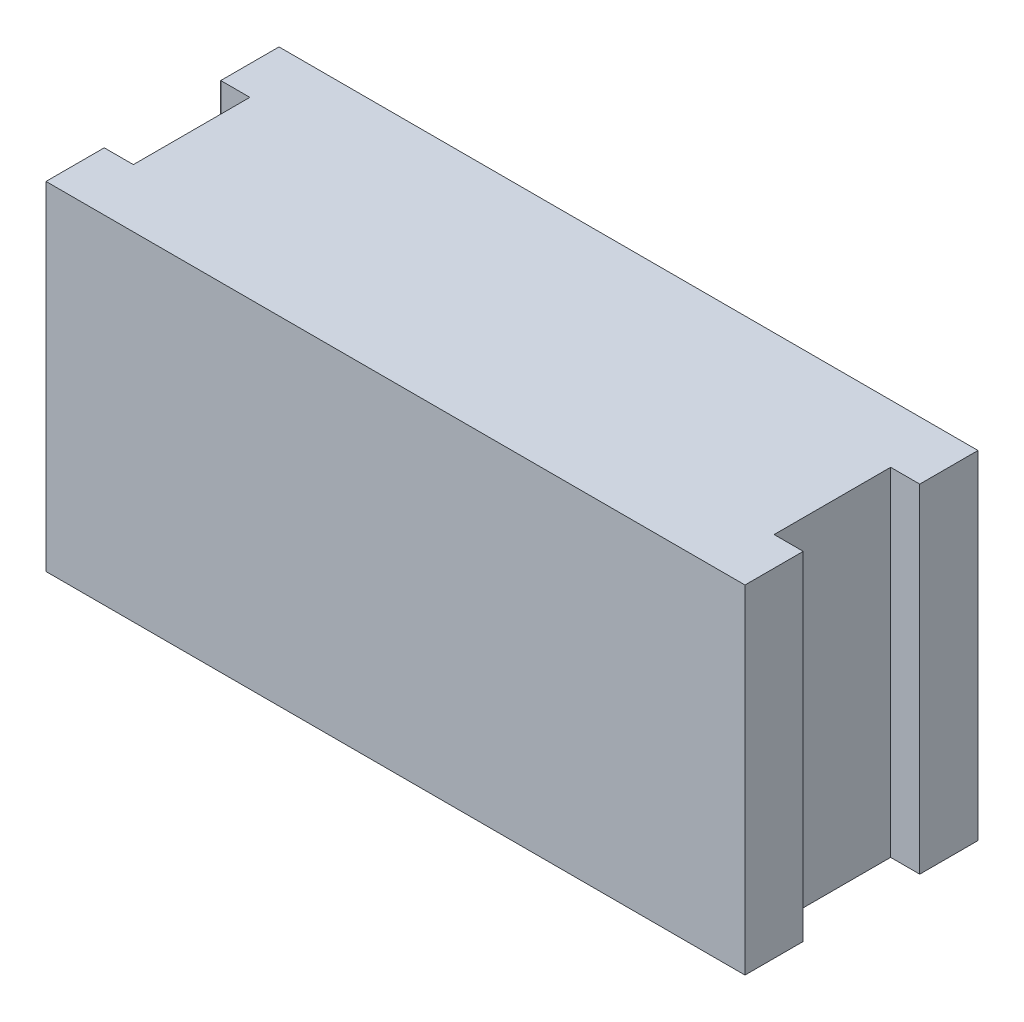
ISO-10303-21;
HEADER;
FILE_DESCRIPTION(('STEP AP214'),'2;1');
FILE_NAME('part.step','',(''),(''),'','','');
FILE_SCHEMA(('AUTOMOTIVE_DESIGN { 1 0 10303 214 1 1 1 1 }'));
ENDSEC;
DATA;
#1=APPLICATION_CONTEXT('core data for automotive mechanical design processes');
#2=APPLICATION_PROTOCOL_DEFINITION('international standard','automotive_design',2000,#1);
#3=PRODUCT_CONTEXT('',#1,'mechanical');
#4=PRODUCT('Part','Part','',(#3));
#5=PRODUCT_RELATED_PRODUCT_CATEGORY('part','',(#4));
#6=PRODUCT_DEFINITION_FORMATION('','',#4);
#7=PRODUCT_DEFINITION_CONTEXT('part definition',#1,'design');
#8=PRODUCT_DEFINITION('design','',#6,#7);
#9=PRODUCT_DEFINITION_SHAPE('','',#8);
#10=(LENGTH_UNIT() NAMED_UNIT(*) SI_UNIT(.MILLI.,.METRE.));
#11=(NAMED_UNIT(*) PLANE_ANGLE_UNIT() SI_UNIT($,.RADIAN.));
#12=(NAMED_UNIT(*) SI_UNIT($,.STERADIAN.) SOLID_ANGLE_UNIT());
#13=UNCERTAINTY_MEASURE_WITH_UNIT(LENGTH_MEASURE(1.E-05),#10,'distance_accuracy_value','');
#14=(GEOMETRIC_REPRESENTATION_CONTEXT(3) GLOBAL_UNCERTAINTY_ASSIGNED_CONTEXT((#13)) GLOBAL_UNIT_ASSIGNED_CONTEXT((#10,
#11,#12)) REPRESENTATION_CONTEXT('',''));
#15=CARTESIAN_POINT('',(0.,0.,0.));
#16=DIRECTION('',(0.,0.,1.));
#17=DIRECTION('',(1.,0.,0.));
#18=AXIS2_PLACEMENT_3D('',#15,#16,#17);
#19=CARTESIAN_POINT('',(-600.,580.,-100.));
#20=DIRECTION('',(0.,0.,-1.));
#21=DIRECTION('',(-1.,0.,0.));
#22=AXIS2_PLACEMENT_3D('',#19,#20,#21);
#23=PLANE('',#22);
#24=DIRECTION('',(1.,0.,0.));
#25=VECTOR('',#24,1.);
#26=CARTESIAN_POINT('',(-600.,-2.22044604925031E-13,-100.));
#27=LINE('',#26,#25);
#28=CARTESIAN_POINT('',(-600.,-2.22044604925031E-13,-100.));
#29=VERTEX_POINT('',#28);
#30=CARTESIAN_POINT('',(-550.,-2.22044604925031E-13,-100.));
#31=VERTEX_POINT('',#30);
#32=EDGE_CURVE('E164',#29,#31,#27,.T.);
#33=ORIENTED_EDGE('',*,*,#32,.T.);
#34=DIRECTION('',(0.,-1.,0.));
#35=VECTOR('',#34,1.);
#36=CARTESIAN_POINT('',(-550.,580.,-100.));
#37=LINE('',#36,#35);
#38=CARTESIAN_POINT('',(-550.,580.,-100.));
#39=VERTEX_POINT('',#38);
#40=EDGE_CURVE('E11',#39,#31,#37,.T.);
#41=ORIENTED_EDGE('',*,*,#40,.F.);
#42=DIRECTION('',(1.,0.,0.));
#43=VECTOR('',#42,1.);
#44=CARTESIAN_POINT('',(-600.,580.,-100.));
#45=LINE('',#44,#43);
#46=CARTESIAN_POINT('',(-600.,580.,-100.));
#47=VERTEX_POINT('',#46);
#48=EDGE_CURVE('E198',#47,#39,#45,.T.);
#49=ORIENTED_EDGE('',*,*,#48,.F.);
#50=DIRECTION('',(0.,-1.,0.));
#51=VECTOR('',#50,1.);
#52=CARTESIAN_POINT('',(-600.,580.,-100.));
#53=LINE('',#52,#51);
#54=EDGE_CURVE('E160',#47,#29,#53,.T.);
#55=ORIENTED_EDGE('',*,*,#54,.T.);
#56=EDGE_LOOP('',(#33,#41,#49,#55));
#57=FACE_BOUND('',#56,.T.);
#58=ADVANCED_FACE('F38',(#57),#23,.F.);
#59=CARTESIAN_POINT('',(-550.,580.,-100.));
#60=DIRECTION('',(1.,0.,0.));
#61=DIRECTION('',(0.,0.,-1.));
#62=AXIS2_PLACEMENT_3D('',#59,#60,#61);
#63=PLANE('',#62);
#64=DIRECTION('',(0.,0.,1.));
#65=VECTOR('',#64,1.);
#66=CARTESIAN_POINT('',(-550.,-2.22044604925031E-13,-100.));
#67=LINE('',#66,#65);
#68=CARTESIAN_POINT('',(-550.,-2.22044604925031E-13,100.));
#69=VERTEX_POINT('',#68);
#70=EDGE_CURVE('E168',#31,#69,#67,.T.);
#71=ORIENTED_EDGE('',*,*,#70,.T.);
#72=DIRECTION('',(0.,-1.,0.));
#73=VECTOR('',#72,1.);
#74=CARTESIAN_POINT('',(-550.,580.,100.));
#75=LINE('',#74,#73);
#76=CARTESIAN_POINT('',(-550.,580.,100.));
#77=VERTEX_POINT('',#76);
#78=EDGE_CURVE('E47',#77,#69,#75,.T.);
#79=ORIENTED_EDGE('',*,*,#78,.F.);
#80=DIRECTION('',(0.,0.,1.));
#81=VECTOR('',#80,1.);
#82=CARTESIAN_POINT('',(-550.,580.,-100.));
#83=LINE('',#82,#81);
#84=EDGE_CURVE('E110',#39,#77,#83,.T.);
#85=ORIENTED_EDGE('',*,*,#84,.F.);
#86=ORIENTED_EDGE('',*,*,#40,.T.);
#87=EDGE_LOOP('',(#71,#79,#85,#86));
#88=FACE_BOUND('',#87,.T.);
#89=ADVANCED_FACE('F299',(#88),#63,.F.);
#90=CARTESIAN_POINT('',(-550.,580.,100.));
#91=DIRECTION('',(0.,0.,1.));
#92=DIRECTION('',(1.,0.,0.));
#93=AXIS2_PLACEMENT_3D('',#90,#91,#92);
#94=PLANE('',#93);
#95=DIRECTION('',(-1.,0.,0.));
#96=VECTOR('',#95,1.);
#97=CARTESIAN_POINT('',(-550.,-2.22044604925031E-13,100.));
#98=LINE('',#97,#96);
#99=CARTESIAN_POINT('',(-600.000000000001,-2.22044604925031E-13,100.));
#100=VERTEX_POINT('',#99);
#101=EDGE_CURVE('E171',#69,#100,#98,.T.);
#102=ORIENTED_EDGE('',*,*,#101,.T.);
#103=DIRECTION('',(0.,-1.,0.));
#104=VECTOR('',#103,1.);
#105=CARTESIAN_POINT('',(-600.,580.,100.));
#106=LINE('',#105,#104);
#107=CARTESIAN_POINT('',(-600.,580.,100.));
#108=VERTEX_POINT('',#107);
#109=EDGE_CURVE('E225',#108,#100,#106,.T.);
#110=ORIENTED_EDGE('',*,*,#109,.F.);
#111=DIRECTION('',(-1.,0.,0.));
#112=VECTOR('',#111,1.);
#113=CARTESIAN_POINT('',(-550.,580.,100.));
#114=LINE('',#113,#112);
#115=EDGE_CURVE('E236',#77,#108,#114,.T.);
#116=ORIENTED_EDGE('',*,*,#115,.F.);
#117=ORIENTED_EDGE('',*,*,#78,.T.);
#118=EDGE_LOOP('',(#102,#110,#116,#117));
#119=FACE_BOUND('',#118,.T.);
#120=ADVANCED_FACE('F234',(#119),#94,.F.);
#121=CARTESIAN_POINT('',(-600.,580.,100.));
#122=DIRECTION('',(1.,0.,0.));
#123=DIRECTION('',(0.,0.,-1.));
#124=AXIS2_PLACEMENT_3D('',#121,#122,#123);
#125=PLANE('',#124);
#126=DIRECTION('',(0.,0.,1.));
#127=VECTOR('',#126,1.);
#128=CARTESIAN_POINT('',(-600.000000000001,-2.22044604925031E-13,100.));
#129=LINE('',#128,#127);
#130=CARTESIAN_POINT('',(-600.,-2.22044604925031E-13,200.));
#131=VERTEX_POINT('',#130);
#132=EDGE_CURVE('E174',#100,#131,#129,.T.);
#133=ORIENTED_EDGE('',*,*,#132,.T.);
#134=DIRECTION('',(0.,-1.,0.));
#135=VECTOR('',#134,1.);
#136=CARTESIAN_POINT('',(-600.,580.,200.));
#137=LINE('',#136,#135);
#138=CARTESIAN_POINT('',(-600.,580.,200.));
#139=VERTEX_POINT('',#138);
#140=EDGE_CURVE('E221',#139,#131,#137,.T.);
#141=ORIENTED_EDGE('',*,*,#140,.F.);
#142=DIRECTION('',(0.,0.,1.));
#143=VECTOR('',#142,1.);
#144=CARTESIAN_POINT('',(-600.,580.,100.));
#145=LINE('',#144,#143);
#146=EDGE_CURVE('E255',#108,#139,#145,.T.);
#147=ORIENTED_EDGE('',*,*,#146,.F.);
#148=ORIENTED_EDGE('',*,*,#109,.T.);
#149=EDGE_LOOP('',(#133,#141,#147,#148));
#150=FACE_BOUND('',#149,.T.);
#151=ADVANCED_FACE('F245',(#150),#125,.F.);
#152=CARTESIAN_POINT('',(-600.,580.,200.));
#153=DIRECTION('',(0.,0.,-1.));
#154=DIRECTION('',(-1.,0.,0.));
#155=AXIS2_PLACEMENT_3D('',#152,#153,#154);
#156=PLANE('',#155);
#157=DIRECTION('',(1.,0.,0.));
#158=VECTOR('',#157,1.);
#159=CARTESIAN_POINT('',(-600.,-2.22044604925031E-13,200.));
#160=LINE('',#159,#158);
#161=CARTESIAN_POINT('',(600.000000000001,0.,200.));
#162=VERTEX_POINT('',#161);
#163=EDGE_CURVE('E177',#131,#162,#160,.T.);
#164=ORIENTED_EDGE('',*,*,#163,.T.);
#165=DIRECTION('',(0.,-1.,0.));
#166=VECTOR('',#165,1.);
#167=CARTESIAN_POINT('',(600.000000000001,580.,200.));
#168=LINE('',#167,#166);
#169=CARTESIAN_POINT('',(600.000000000001,580.,200.));
#170=VERTEX_POINT('',#169);
#171=EDGE_CURVE('E217',#170,#162,#168,.T.);
#172=ORIENTED_EDGE('',*,*,#171,.F.);
#173=DIRECTION('',(1.,0.,0.));
#174=VECTOR('',#173,1.);
#175=CARTESIAN_POINT('',(-600.,580.,200.));
#176=LINE('',#175,#174);
#177=EDGE_CURVE('E251',#139,#170,#176,.T.);
#178=ORIENTED_EDGE('',*,*,#177,.F.);
#179=ORIENTED_EDGE('',*,*,#140,.T.);
#180=EDGE_LOOP('',(#164,#172,#178,#179));
#181=FACE_BOUND('',#180,.T.);
#182=ADVANCED_FACE('F249',(#181),#156,.F.);
#183=CARTESIAN_POINT('',(600.,580.,100.));
#184=DIRECTION('',(-1.,0.,0.));
#185=DIRECTION('',(0.,0.,1.));
#186=AXIS2_PLACEMENT_3D('',#183,#184,#185);
#187=PLANE('',#186);
#188=DIRECTION('',(0.,0.,-1.));
#189=VECTOR('',#188,1.);
#190=CARTESIAN_POINT('',(600.,0.,100.));
#191=LINE('',#190,#189);
#192=CARTESIAN_POINT('',(600.,0.,100.));
#193=VERTEX_POINT('',#192);
#194=EDGE_CURVE('E180',#162,#193,#191,.T.);
#195=ORIENTED_EDGE('',*,*,#194,.T.);
#196=DIRECTION('',(0.,-1.,0.));
#197=VECTOR('',#196,1.);
#198=CARTESIAN_POINT('',(600.,580.,100.));
#199=LINE('',#198,#197);
#200=CARTESIAN_POINT('',(600.,580.,100.));
#201=VERTEX_POINT('',#200);
#202=EDGE_CURVE('E213',#201,#193,#199,.T.);
#203=ORIENTED_EDGE('',*,*,#202,.F.);
#204=DIRECTION('',(0.,0.,-1.));
#205=VECTOR('',#204,1.);
#206=CARTESIAN_POINT('',(600.,580.,100.));
#207=LINE('',#206,#205);
#208=EDGE_CURVE('E254',#170,#201,#207,.T.);
#209=ORIENTED_EDGE('',*,*,#208,.F.);
#210=ORIENTED_EDGE('',*,*,#171,.T.);
#211=EDGE_LOOP('',(#195,#203,#209,#210));
#212=FACE_BOUND('',#211,.T.);
#213=ADVANCED_FACE('F312',(#212),#187,.F.);
#214=CARTESIAN_POINT('',(550.,580.,100.));
#215=DIRECTION('',(0.,0.,1.));
#216=DIRECTION('',(1.,0.,0.));
#217=AXIS2_PLACEMENT_3D('',#214,#215,#216);
#218=PLANE('',#217);
#219=DIRECTION('',(-1.,0.,0.));
#220=VECTOR('',#219,1.);
#221=CARTESIAN_POINT('',(550.,0.,100.));
#222=LINE('',#221,#220);
#223=CARTESIAN_POINT('',(550.,0.,100.));
#224=VERTEX_POINT('',#223);
#225=EDGE_CURVE('E183',#193,#224,#222,.T.);
#226=ORIENTED_EDGE('',*,*,#225,.T.);
#227=DIRECTION('',(0.,-1.,0.));
#228=VECTOR('',#227,1.);
#229=CARTESIAN_POINT('',(550.,580.,100.));
#230=LINE('',#229,#228);
#231=CARTESIAN_POINT('',(550.,580.,100.));
#232=VERTEX_POINT('',#231);
#233=EDGE_CURVE('E209',#232,#224,#230,.T.);
#234=ORIENTED_EDGE('',*,*,#233,.F.);
#235=DIRECTION('',(-1.,0.,0.));
#236=VECTOR('',#235,1.);
#237=CARTESIAN_POINT('',(550.,580.,100.));
#238=LINE('',#237,#236);
#239=EDGE_CURVE('E260',#201,#232,#238,.T.);
#240=ORIENTED_EDGE('',*,*,#239,.F.);
#241=ORIENTED_EDGE('',*,*,#202,.T.);
#242=EDGE_LOOP('',(#226,#234,#240,#241));
#243=FACE_BOUND('',#242,.T.);
#244=ADVANCED_FACE('F315',(#243),#218,.F.);
#245=CARTESIAN_POINT('',(550.000000000001,580.,-100.));
#246=DIRECTION('',(-1.,0.,0.));
#247=DIRECTION('',(0.,0.,1.));
#248=AXIS2_PLACEMENT_3D('',#245,#246,#247);
#249=PLANE('',#248);
#250=DIRECTION('',(0.,0.,-1.));
#251=VECTOR('',#250,1.);
#252=CARTESIAN_POINT('',(550.,0.,-100.));
#253=LINE('',#252,#251);
#254=CARTESIAN_POINT('',(550.,0.,-100.));
#255=VERTEX_POINT('',#254);
#256=EDGE_CURVE('E186',#224,#255,#253,.T.);
#257=ORIENTED_EDGE('',*,*,#256,.T.);
#258=DIRECTION('',(0.,-1.,0.));
#259=VECTOR('',#258,1.);
#260=CARTESIAN_POINT('',(550.000000000001,580.,-100.));
#261=LINE('',#260,#259);
#262=CARTESIAN_POINT('',(550.000000000001,580.,-100.));
#263=VERTEX_POINT('',#262);
#264=EDGE_CURVE('E205',#263,#255,#261,.T.);
#265=ORIENTED_EDGE('',*,*,#264,.F.);
#266=DIRECTION('',(0.,0.,-1.));
#267=VECTOR('',#266,1.);
#268=CARTESIAN_POINT('',(550.000000000001,580.,-100.));
#269=LINE('',#268,#267);
#270=EDGE_CURVE('E267',#232,#263,#269,.T.);
#271=ORIENTED_EDGE('',*,*,#270,.F.);
#272=ORIENTED_EDGE('',*,*,#233,.T.);
#273=EDGE_LOOP('',(#257,#265,#271,#272));
#274=FACE_BOUND('',#273,.T.);
#275=ADVANCED_FACE('F280',(#274),#249,.F.);
#276=CARTESIAN_POINT('',(600.000000000001,580.,-100.));
#277=DIRECTION('',(0.,0.,-1.));
#278=DIRECTION('',(-1.,0.,0.));
#279=AXIS2_PLACEMENT_3D('',#276,#277,#278);
#280=PLANE('',#279);
#281=DIRECTION('',(1.,0.,0.));
#282=VECTOR('',#281,1.);
#283=CARTESIAN_POINT('',(600.000000000001,0.,-100.));
#284=LINE('',#283,#282);
#285=CARTESIAN_POINT('',(600.000000000001,0.,-100.));
#286=VERTEX_POINT('',#285);
#287=EDGE_CURVE('E189',#255,#286,#284,.T.);
#288=ORIENTED_EDGE('',*,*,#287,.T.);
#289=DIRECTION('',(0.,-1.,0.));
#290=VECTOR('',#289,1.);
#291=CARTESIAN_POINT('',(600.000000000001,580.,-100.));
#292=LINE('',#291,#290);
#293=CARTESIAN_POINT('',(600.000000000001,580.,-100.));
#294=VERTEX_POINT('',#293);
#295=EDGE_CURVE('E152',#294,#286,#292,.T.);
#296=ORIENTED_EDGE('',*,*,#295,.F.);
#297=DIRECTION('',(1.,0.,0.));
#298=VECTOR('',#297,1.);
#299=CARTESIAN_POINT('',(600.000000000001,580.,-100.));
#300=LINE('',#299,#298);
#301=EDGE_CURVE('E141',#263,#294,#300,.T.);
#302=ORIENTED_EDGE('',*,*,#301,.F.);
#303=ORIENTED_EDGE('',*,*,#264,.T.);
#304=EDGE_LOOP('',(#288,#296,#302,#303));
#305=FACE_BOUND('',#304,.T.);
#306=ADVANCED_FACE('F284',(#305),#280,.F.);
#307=CARTESIAN_POINT('',(600.000000000001,580.,-200.));
#308=DIRECTION('',(-1.,0.,0.));
#309=DIRECTION('',(0.,0.,1.));
#310=AXIS2_PLACEMENT_3D('',#307,#308,#309);
#311=PLANE('',#310);
#312=DIRECTION('',(0.,0.,-1.));
#313=VECTOR('',#312,1.);
#314=CARTESIAN_POINT('',(600.000000000001,0.,-200.));
#315=LINE('',#314,#313);
#316=CARTESIAN_POINT('',(600.000000000001,0.,-200.));
#317=VERTEX_POINT('',#316);
#318=EDGE_CURVE('E150',#286,#317,#315,.T.);
#319=ORIENTED_EDGE('',*,*,#318,.T.);
#320=DIRECTION('',(0.,-1.,0.));
#321=VECTOR('',#320,1.);
#322=CARTESIAN_POINT('',(600.000000000001,580.,-200.));
#323=LINE('',#322,#321);
#324=CARTESIAN_POINT('',(600.000000000001,580.,-200.));
#325=VERTEX_POINT('',#324);
#326=EDGE_CURVE('E147',#325,#317,#323,.T.);
#327=ORIENTED_EDGE('',*,*,#326,.F.);
#328=DIRECTION('',(0.,0.,-1.));
#329=VECTOR('',#328,1.);
#330=CARTESIAN_POINT('',(600.000000000001,580.,-200.));
#331=LINE('',#330,#329);
#332=EDGE_CURVE('E135',#294,#325,#331,.T.);
#333=ORIENTED_EDGE('',*,*,#332,.F.);
#334=ORIENTED_EDGE('',*,*,#295,.T.);
#335=EDGE_LOOP('',(#319,#327,#333,#334));
#336=FACE_BOUND('',#335,.T.);
#337=ADVANCED_FACE('F148',(#336),#311,.F.);
#338=CARTESIAN_POINT('',(-600.,580.,-200.));
#339=DIRECTION('',(0.,0.,1.));
#340=DIRECTION('',(1.,0.,0.));
#341=AXIS2_PLACEMENT_3D('',#338,#339,#340);
#342=PLANE('',#341);
#343=DIRECTION('',(-1.,0.,0.));
#344=VECTOR('',#343,1.);
#345=CARTESIAN_POINT('',(-600.,-2.22044604925031E-13,-200.));
#346=LINE('',#345,#344);
#347=CARTESIAN_POINT('',(-600.,-2.22044604925031E-13,-200.));
#348=VERTEX_POINT('',#347);
#349=EDGE_CURVE('E96',#317,#348,#346,.T.);
#350=ORIENTED_EDGE('',*,*,#349,.T.);
#351=DIRECTION('',(0.,-1.,0.));
#352=VECTOR('',#351,1.);
#353=CARTESIAN_POINT('',(-600.,580.,-200.));
#354=LINE('',#353,#352);
#355=CARTESIAN_POINT('',(-600.,580.,-200.));
#356=VERTEX_POINT('',#355);
#357=EDGE_CURVE('E153',#356,#348,#354,.T.);
#358=ORIENTED_EDGE('',*,*,#357,.F.);
#359=DIRECTION('',(-1.,0.,0.));
#360=VECTOR('',#359,1.);
#361=CARTESIAN_POINT('',(-600.,580.,-200.));
#362=LINE('',#361,#360);
#363=EDGE_CURVE('E139',#325,#356,#362,.T.);
#364=ORIENTED_EDGE('',*,*,#363,.F.);
#365=ORIENTED_EDGE('',*,*,#326,.T.);
#366=EDGE_LOOP('',(#350,#358,#364,#365));
#367=FACE_BOUND('',#366,.T.);
#368=ADVANCED_FACE('F155',(#367),#342,.F.);
#369=CARTESIAN_POINT('',(-600.,580.,-200.));
#370=DIRECTION('',(1.,0.,0.));
#371=DIRECTION('',(0.,0.,-1.));
#372=AXIS2_PLACEMENT_3D('',#369,#370,#371);
#373=PLANE('',#372);
#374=DIRECTION('',(0.,0.,1.));
#375=VECTOR('',#374,1.);
#376=CARTESIAN_POINT('',(-600.,-2.22044604925031E-13,-200.));
#377=LINE('',#376,#375);
#378=EDGE_CURVE('E102',#348,#29,#377,.T.);
#379=ORIENTED_EDGE('',*,*,#378,.T.);
#380=ORIENTED_EDGE('',*,*,#54,.F.);
#381=DIRECTION('',(0.,0.,1.));
#382=VECTOR('',#381,1.);
#383=CARTESIAN_POINT('',(-600.,580.,-200.));
#384=LINE('',#383,#382);
#385=EDGE_CURVE('E55',#356,#47,#384,.T.);
#386=ORIENTED_EDGE('',*,*,#385,.F.);
#387=ORIENTED_EDGE('',*,*,#357,.T.);
#388=EDGE_LOOP('',(#379,#380,#386,#387));
#389=FACE_BOUND('',#388,.T.);
#390=ADVANCED_FACE('F288',(#389),#373,.F.);
#391=CARTESIAN_POINT('',(0.,580.,0.));
#392=DIRECTION('',(0.,-1.,0.));
#393=DIRECTION('',(0.,0.,-1.));
#394=AXIS2_PLACEMENT_3D('',#391,#392,#393);
#395=PLANE('',#394);
#396=ORIENTED_EDGE('',*,*,#48,.T.);
#397=ORIENTED_EDGE('',*,*,#84,.T.);
#398=ORIENTED_EDGE('',*,*,#115,.T.);
#399=ORIENTED_EDGE('',*,*,#146,.T.);
#400=ORIENTED_EDGE('',*,*,#177,.T.);
#401=ORIENTED_EDGE('',*,*,#208,.T.);
#402=ORIENTED_EDGE('',*,*,#239,.T.);
#403=ORIENTED_EDGE('',*,*,#270,.T.);
#404=ORIENTED_EDGE('',*,*,#301,.T.);
#405=ORIENTED_EDGE('',*,*,#332,.T.);
#406=ORIENTED_EDGE('',*,*,#363,.T.);
#407=ORIENTED_EDGE('',*,*,#385,.T.);
#408=EDGE_LOOP('',(#396,#397,#398,#399,#400,#401,#402,#403,#404,#405,#406,#407));
#409=FACE_BOUND('',#408,.T.);
#410=ADVANCED_FACE('F137',(#409),#395,.F.);
#411=CARTESIAN_POINT('',(0.,0.,0.));
#412=DIRECTION('',(0.,-1.,0.));
#413=DIRECTION('',(0.,0.,-1.));
#414=AXIS2_PLACEMENT_3D('',#411,#412,#413);
#415=PLANE('',#414);
#416=ORIENTED_EDGE('',*,*,#32,.F.);
#417=ORIENTED_EDGE('',*,*,#378,.F.);
#418=ORIENTED_EDGE('',*,*,#349,.F.);
#419=ORIENTED_EDGE('',*,*,#318,.F.);
#420=ORIENTED_EDGE('',*,*,#287,.F.);
#421=ORIENTED_EDGE('',*,*,#256,.F.);
#422=ORIENTED_EDGE('',*,*,#225,.F.);
#423=ORIENTED_EDGE('',*,*,#194,.F.);
#424=ORIENTED_EDGE('',*,*,#163,.F.);
#425=ORIENTED_EDGE('',*,*,#132,.F.);
#426=ORIENTED_EDGE('',*,*,#101,.F.);
#427=ORIENTED_EDGE('',*,*,#70,.F.);
#428=EDGE_LOOP('',(#416,#417,#418,#419,#420,#421,#422,#423,#424,#425,#426,#427));
#429=FACE_BOUND('',#428,.T.);
#430=ADVANCED_FACE('F240',(#429),#415,.T.);
#431=CLOSED_SHELL('',(#58,#89,#120,#151,#182,#213,#244,#275,#306,#337,#368,#390,#410,#430));
#432=MANIFOLD_SOLID_BREP('B2',#431);
#433=ADVANCED_BREP_SHAPE_REPRESENTATION('',(#18,#432),#14);
#434=SHAPE_DEFINITION_REPRESENTATION(#9,#433);
ENDSEC;
END-ISO-10303-21;
